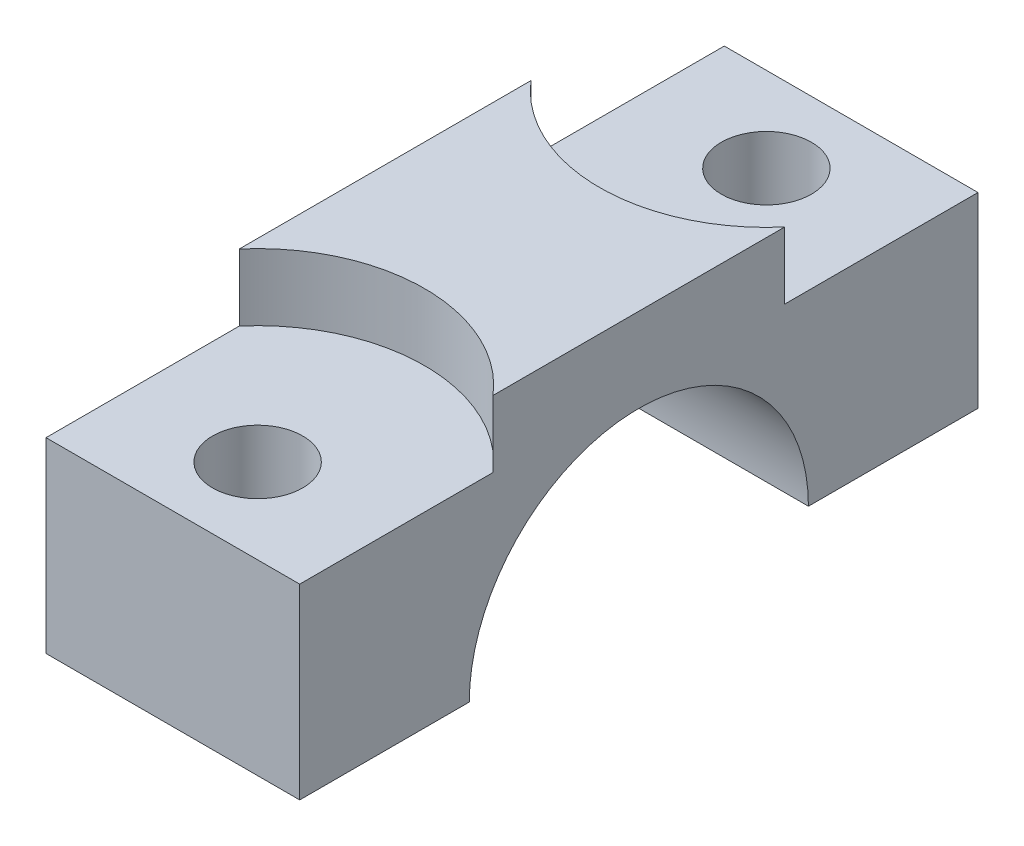
ISO-10303-21;
HEADER;
FILE_DESCRIPTION(('STEP AP214'),'2;1');
FILE_NAME('part.step','',(''),(''),'','','');
FILE_SCHEMA(('AUTOMOTIVE_DESIGN { 1 0 10303 214 1 1 1 1 }'));
ENDSEC;
DATA;
#1=APPLICATION_CONTEXT('core data for automotive mechanical design processes');
#2=APPLICATION_PROTOCOL_DEFINITION('international standard','automotive_design',2000,#1);
#3=PRODUCT_CONTEXT('',#1,'mechanical');
#4=PRODUCT('Part','Part','',(#3));
#5=PRODUCT_RELATED_PRODUCT_CATEGORY('part','',(#4));
#6=PRODUCT_DEFINITION_FORMATION('','',#4);
#7=PRODUCT_DEFINITION_CONTEXT('part definition',#1,'design');
#8=PRODUCT_DEFINITION('design','',#6,#7);
#9=PRODUCT_DEFINITION_SHAPE('','',#8);
#10=(LENGTH_UNIT() NAMED_UNIT(*) SI_UNIT(.MILLI.,.METRE.));
#11=(NAMED_UNIT(*) PLANE_ANGLE_UNIT() SI_UNIT($,.RADIAN.));
#12=(NAMED_UNIT(*) SI_UNIT($,.STERADIAN.) SOLID_ANGLE_UNIT());
#13=UNCERTAINTY_MEASURE_WITH_UNIT(LENGTH_MEASURE(1.E-05),#10,'distance_accuracy_value','');
#14=(GEOMETRIC_REPRESENTATION_CONTEXT(3) GLOBAL_UNCERTAINTY_ASSIGNED_CONTEXT((#13)) GLOBAL_UNIT_ASSIGNED_CONTEXT((#10,
#11,#12)) REPRESENTATION_CONTEXT('',''));
#15=CARTESIAN_POINT('',(0.,0.,0.));
#16=DIRECTION('',(0.,0.,1.));
#17=DIRECTION('',(1.,0.,0.));
#18=AXIS2_PLACEMENT_3D('',#15,#16,#17);
#19=CARTESIAN_POINT('',(9.5,19.,25.4));
#20=DIRECTION('',(0.,-1.,0.));
#21=DIRECTION('',(0.,0.,-1.));
#22=AXIS2_PLACEMENT_3D('',#19,#20,#21);
#23=PLANE('',#22);
#24=CARTESIAN_POINT('',(0.,19.,-19.05));
#25=DIRECTION('',(0.,1.,0.));
#26=DIRECTION('',(0.,0.,1.));
#27=AXIS2_PLACEMENT_3D('',#24,#25,#26);
#28=CIRCLE('',#27,12.5);
#29=CARTESIAN_POINT('',(-9.5,19.,-10.925961595364));
#30=VERTEX_POINT('',#29);
#31=CARTESIAN_POINT('',(9.5,19.,-10.925961595364));
#32=VERTEX_POINT('',#31);
#33=EDGE_CURVE('E55',#30,#32,#28,.T.);
#34=ORIENTED_EDGE('',*,*,#33,.F.);
#35=DIRECTION('',(0.,0.,1.));
#36=VECTOR('',#35,1.);
#37=CARTESIAN_POINT('',(-9.5,19.,25.4));
#38=LINE('',#37,#36);
#39=CARTESIAN_POINT('',(-9.5,19.,10.925961595364));
#40=VERTEX_POINT('',#39);
#41=EDGE_CURVE('E130',#30,#40,#38,.T.);
#42=ORIENTED_EDGE('',*,*,#41,.T.);
#43=CARTESIAN_POINT('',(0.,19.,19.05));
#44=DIRECTION('',(0.,1.,0.));
#45=DIRECTION('',(0.,0.,1.));
#46=AXIS2_PLACEMENT_3D('',#43,#44,#45);
#47=CIRCLE('',#46,12.5);
#48=CARTESIAN_POINT('',(9.5,19.,10.925961595364));
#49=VERTEX_POINT('',#48);
#50=EDGE_CURVE('E207',#49,#40,#47,.T.);
#51=ORIENTED_EDGE('',*,*,#50,.F.);
#52=DIRECTION('',(0.,0.,1.));
#53=VECTOR('',#52,1.);
#54=CARTESIAN_POINT('',(9.5,19.,25.4));
#55=LINE('',#54,#53);
#56=EDGE_CURVE('E132',#32,#49,#55,.T.);
#57=ORIENTED_EDGE('',*,*,#56,.F.);
#58=EDGE_LOOP('',(#34,#42,#51,#57));
#59=FACE_BOUND('',#58,.T.);
#60=ADVANCED_FACE('F39',(#59),#23,.F.);
#61=CARTESIAN_POINT('',(9.5,19.,-25.4));
#62=DIRECTION('',(0.,0.,1.));
#63=DIRECTION('',(1.,0.,0.));
#64=AXIS2_PLACEMENT_3D('',#61,#62,#63);
#65=PLANE('',#64);
#66=DIRECTION('',(0.,1.,0.));
#67=VECTOR('',#66,1.);
#68=CARTESIAN_POINT('',(-9.5,19.,-25.4));
#69=LINE('',#68,#67);
#70=CARTESIAN_POINT('',(-9.5,0.,-25.4));
#71=VERTEX_POINT('',#70);
#72=CARTESIAN_POINT('',(-9.5,14.,-25.4));
#73=VERTEX_POINT('',#72);
#74=EDGE_CURVE('E141',#71,#73,#69,.T.);
#75=ORIENTED_EDGE('',*,*,#74,.T.);
#76=DIRECTION('',(1.,0.,0.));
#77=VECTOR('',#76,1.);
#78=CARTESIAN_POINT('',(9.5,14.,-25.4));
#79=LINE('',#78,#77);
#80=CARTESIAN_POINT('',(9.5,14.,-25.4));
#81=VERTEX_POINT('',#80);
#82=EDGE_CURVE('E124',#73,#81,#79,.T.);
#83=ORIENTED_EDGE('',*,*,#82,.T.);
#84=DIRECTION('',(0.,1.,0.));
#85=VECTOR('',#84,1.);
#86=CARTESIAN_POINT('',(9.5,19.,-25.4));
#87=LINE('',#86,#85);
#88=CARTESIAN_POINT('',(9.5,0.,-25.4));
#89=VERTEX_POINT('',#88);
#90=EDGE_CURVE('E159',#89,#81,#87,.T.);
#91=ORIENTED_EDGE('',*,*,#90,.F.);
#92=DIRECTION('',(-1.,0.,0.));
#93=VECTOR('',#92,1.);
#94=CARTESIAN_POINT('',(9.5,0.,-25.4));
#95=LINE('',#94,#93);
#96=EDGE_CURVE('E160',#89,#71,#95,.T.);
#97=ORIENTED_EDGE('',*,*,#96,.T.);
#98=EDGE_LOOP('',(#75,#83,#91,#97));
#99=FACE_BOUND('',#98,.T.);
#100=ADVANCED_FACE('F41',(#99),#65,.F.);
#101=CARTESIAN_POINT('',(9.5,19.,25.4));
#102=DIRECTION('',(0.,0.,-1.));
#103=DIRECTION('',(-1.,0.,0.));
#104=AXIS2_PLACEMENT_3D('',#101,#102,#103);
#105=PLANE('',#104);
#106=DIRECTION('',(0.,-1.,0.));
#107=VECTOR('',#106,1.);
#108=CARTESIAN_POINT('',(9.5,19.,25.4));
#109=LINE('',#108,#107);
#110=CARTESIAN_POINT('',(9.5,14.,25.4));
#111=VERTEX_POINT('',#110);
#112=CARTESIAN_POINT('',(9.5,0.,25.4));
#113=VERTEX_POINT('',#112);
#114=EDGE_CURVE('E233',#111,#113,#109,.T.);
#115=ORIENTED_EDGE('',*,*,#114,.F.);
#116=DIRECTION('',(-1.,0.,0.));
#117=VECTOR('',#116,1.);
#118=CARTESIAN_POINT('',(9.5,14.,25.4));
#119=LINE('',#118,#117);
#120=CARTESIAN_POINT('',(-9.5,14.,25.4));
#121=VERTEX_POINT('',#120);
#122=EDGE_CURVE('E63',#111,#121,#119,.T.);
#123=ORIENTED_EDGE('',*,*,#122,.T.);
#124=DIRECTION('',(0.,-1.,0.));
#125=VECTOR('',#124,1.);
#126=CARTESIAN_POINT('',(-9.5,19.,25.4));
#127=LINE('',#126,#125);
#128=CARTESIAN_POINT('',(-9.5,0.,25.4));
#129=VERTEX_POINT('',#128);
#130=EDGE_CURVE('E140',#121,#129,#127,.T.);
#131=ORIENTED_EDGE('',*,*,#130,.T.);
#132=DIRECTION('',(-1.,0.,0.));
#133=VECTOR('',#132,1.);
#134=CARTESIAN_POINT('',(9.5,0.,25.4));
#135=LINE('',#134,#133);
#136=EDGE_CURVE('E173',#113,#129,#135,.T.);
#137=ORIENTED_EDGE('',*,*,#136,.F.);
#138=EDGE_LOOP('',(#115,#123,#131,#137));
#139=FACE_BOUND('',#138,.T.);
#140=ADVANCED_FACE('F264',(#139),#105,.F.);
#141=CARTESIAN_POINT('',(9.5,0.,25.4));
#142=DIRECTION('',(0.,1.,0.));
#143=DIRECTION('',(0.,0.,1.));
#144=AXIS2_PLACEMENT_3D('',#141,#142,#143);
#145=PLANE('',#144);
#146=CARTESIAN_POINT('',(0.,0.,19.05));
#147=DIRECTION('',(0.,1.,0.));
#148=DIRECTION('',(0.,0.,1.));
#149=AXIS2_PLACEMENT_3D('',#146,#147,#148);
#150=CIRCLE('',#149,3.375);
#151=CARTESIAN_POINT('',(0.,0.,22.425));
#152=VERTEX_POINT('',#151);
#153=EDGE_CURVE('E218',#152,#152,#150,.T.);
#154=ORIENTED_EDGE('',*,*,#153,.T.);
#155=EDGE_LOOP('',(#154));
#156=FACE_BOUND('',#155,.T.);
#157=DIRECTION('',(0.,0.,-1.));
#158=VECTOR('',#157,1.);
#159=CARTESIAN_POINT('',(-9.5,0.,25.4));
#160=LINE('',#159,#158);
#161=CARTESIAN_POINT('',(-9.5,0.,12.7));
#162=VERTEX_POINT('',#161);
#163=EDGE_CURVE('E145',#129,#162,#160,.T.);
#164=ORIENTED_EDGE('',*,*,#163,.T.);
#165=DIRECTION('',(-1.,0.,0.));
#166=VECTOR('',#165,1.);
#167=CARTESIAN_POINT('',(9.5,0.,12.7));
#168=LINE('',#167,#166);
#169=CARTESIAN_POINT('',(9.5,0.,12.7));
#170=VERTEX_POINT('',#169);
#171=EDGE_CURVE('E169',#170,#162,#168,.T.);
#172=ORIENTED_EDGE('',*,*,#171,.F.);
#173=DIRECTION('',(0.,0.,-1.));
#174=VECTOR('',#173,1.);
#175=CARTESIAN_POINT('',(9.5,0.,25.4));
#176=LINE('',#175,#174);
#177=EDGE_CURVE('E236',#113,#170,#176,.T.);
#178=ORIENTED_EDGE('',*,*,#177,.F.);
#179=ORIENTED_EDGE('',*,*,#136,.T.);
#180=EDGE_LOOP('',(#164,#172,#178,#179));
#181=FACE_BOUND('',#180,.T.);
#182=ADVANCED_FACE('F260',(#156,#181),#145,.F.);
#183=CARTESIAN_POINT('',(9.5,0.,0.));
#184=DIRECTION('',(-1.,0.,0.));
#185=DIRECTION('',(0.,0.,1.));
#186=AXIS2_PLACEMENT_3D('',#183,#184,#185);
#187=CYLINDRICAL_SURFACE('',#186,12.7);
#188=CARTESIAN_POINT('',(-9.5,0.,0.));
#189=DIRECTION('',(-1.,0.,0.));
#190=DIRECTION('',(0.,0.,1.));
#191=AXIS2_PLACEMENT_3D('',#188,#189,#190);
#192=CIRCLE('',#191,12.7);
#193=CARTESIAN_POINT('',(-9.5,0.,-12.7));
#194=VERTEX_POINT('',#193);
#195=EDGE_CURVE('E153',#162,#194,#192,.T.);
#196=ORIENTED_EDGE('',*,*,#195,.T.);
#197=DIRECTION('',(-1.,0.,0.));
#198=VECTOR('',#197,1.);
#199=CARTESIAN_POINT('',(9.5,0.,-12.7));
#200=LINE('',#199,#198);
#201=CARTESIAN_POINT('',(9.5,0.,-12.7));
#202=VERTEX_POINT('',#201);
#203=EDGE_CURVE('E164',#202,#194,#200,.T.);
#204=ORIENTED_EDGE('',*,*,#203,.F.);
#205=CARTESIAN_POINT('',(9.5,0.,0.));
#206=DIRECTION('',(-1.,0.,0.));
#207=DIRECTION('',(0.,0.,1.));
#208=AXIS2_PLACEMENT_3D('',#205,#206,#207);
#209=CIRCLE('',#208,12.7);
#210=EDGE_CURVE('E239',#170,#202,#209,.T.);
#211=ORIENTED_EDGE('',*,*,#210,.F.);
#212=ORIENTED_EDGE('',*,*,#171,.T.);
#213=EDGE_LOOP('',(#196,#204,#211,#212));
#214=FACE_BOUND('',#213,.T.);
#215=ADVANCED_FACE('F256',(#214),#187,.F.);
#216=CARTESIAN_POINT('',(9.5,0.,-12.7));
#217=DIRECTION('',(0.,1.,0.));
#218=DIRECTION('',(0.,0.,1.));
#219=AXIS2_PLACEMENT_3D('',#216,#217,#218);
#220=PLANE('',#219);
#221=CARTESIAN_POINT('',(0.,0.,-19.05));
#222=DIRECTION('',(0.,1.,0.));
#223=DIRECTION('',(0.,0.,1.));
#224=AXIS2_PLACEMENT_3D('',#221,#222,#223);
#225=CIRCLE('',#224,3.375);
#226=CARTESIAN_POINT('',(0.,0.,-15.675));
#227=VERTEX_POINT('',#226);
#228=EDGE_CURVE('E125',#227,#227,#225,.T.);
#229=ORIENTED_EDGE('',*,*,#228,.T.);
#230=EDGE_LOOP('',(#229));
#231=FACE_BOUND('',#230,.T.);
#232=DIRECTION('',(0.,0.,-1.));
#233=VECTOR('',#232,1.);
#234=CARTESIAN_POINT('',(-9.5,0.,-12.7));
#235=LINE('',#234,#233);
#236=EDGE_CURVE('E156',#194,#71,#235,.T.);
#237=ORIENTED_EDGE('',*,*,#236,.T.);
#238=ORIENTED_EDGE('',*,*,#96,.F.);
#239=DIRECTION('',(0.,0.,-1.));
#240=VECTOR('',#239,1.);
#241=CARTESIAN_POINT('',(9.5,0.,-12.7));
#242=LINE('',#241,#240);
#243=EDGE_CURVE('E165',#202,#89,#242,.T.);
#244=ORIENTED_EDGE('',*,*,#243,.F.);
#245=ORIENTED_EDGE('',*,*,#203,.T.);
#246=EDGE_LOOP('',(#237,#238,#244,#245));
#247=FACE_BOUND('',#246,.T.);
#248=ADVANCED_FACE('F248',(#231,#247),#220,.F.);
#249=CARTESIAN_POINT('',(9.5,0.,0.));
#250=DIRECTION('',(-1.,0.,0.));
#251=DIRECTION('',(0.,0.,1.));
#252=AXIS2_PLACEMENT_3D('',#249,#250,#251);
#253=PLANE('',#252);
#254=ORIENTED_EDGE('',*,*,#90,.T.);
#255=DIRECTION('',(0.,0.,1.));
#256=VECTOR('',#255,1.);
#257=CARTESIAN_POINT('',(9.5,14.,0.));
#258=LINE('',#257,#256);
#259=CARTESIAN_POINT('',(9.5,14.,-10.925961595364));
#260=VERTEX_POINT('',#259);
#261=EDGE_CURVE('E11',#81,#260,#258,.T.);
#262=ORIENTED_EDGE('',*,*,#261,.T.);
#263=DIRECTION('',(0.,1.,0.));
#264=VECTOR('',#263,1.);
#265=CARTESIAN_POINT('',(9.5,19.,-10.925961595364));
#266=LINE('',#265,#264);
#267=EDGE_CURVE('E48',#260,#32,#266,.T.);
#268=ORIENTED_EDGE('',*,*,#267,.T.);
#269=ORIENTED_EDGE('',*,*,#56,.T.);
#270=DIRECTION('',(0.,1.,0.));
#271=VECTOR('',#270,1.);
#272=CARTESIAN_POINT('',(9.5,19.,10.925961595364));
#273=LINE('',#272,#271);
#274=CARTESIAN_POINT('',(9.5,14.,10.925961595364));
#275=VERTEX_POINT('',#274);
#276=EDGE_CURVE('E180',#49,#275,#273,.F.);
#277=ORIENTED_EDGE('',*,*,#276,.T.);
#278=DIRECTION('',(0.,0.,1.));
#279=VECTOR('',#278,1.);
#280=CARTESIAN_POINT('',(9.5,14.,0.));
#281=LINE('',#280,#279);
#282=EDGE_CURVE('E177',#275,#111,#281,.T.);
#283=ORIENTED_EDGE('',*,*,#282,.T.);
#284=ORIENTED_EDGE('',*,*,#114,.T.);
#285=ORIENTED_EDGE('',*,*,#177,.T.);
#286=ORIENTED_EDGE('',*,*,#210,.T.);
#287=ORIENTED_EDGE('',*,*,#243,.T.);
#288=EDGE_LOOP('',(#254,#262,#268,#269,#277,#283,#284,#285,#286,#287));
#289=FACE_BOUND('',#288,.T.);
#290=ADVANCED_FACE('F186',(#289),#253,.F.);
#291=CARTESIAN_POINT('',(-9.5,0.,0.));
#292=DIRECTION('',(-1.,0.,0.));
#293=DIRECTION('',(0.,0.,1.));
#294=AXIS2_PLACEMENT_3D('',#291,#292,#293);
#295=PLANE('',#294);
#296=DIRECTION('',(0.,1.,0.));
#297=VECTOR('',#296,1.);
#298=CARTESIAN_POINT('',(-9.5,19.,-10.925961595364));
#299=LINE('',#298,#297);
#300=CARTESIAN_POINT('',(-9.5,14.,-10.925961595364));
#301=VERTEX_POINT('',#300);
#302=EDGE_CURVE('E116',#301,#30,#299,.T.);
#303=ORIENTED_EDGE('',*,*,#302,.F.);
#304=DIRECTION('',(0.,0.,1.));
#305=VECTOR('',#304,1.);
#306=CARTESIAN_POINT('',(-9.5,14.,0.));
#307=LINE('',#306,#305);
#308=EDGE_CURVE('E192',#73,#301,#307,.T.);
#309=ORIENTED_EDGE('',*,*,#308,.F.);
#310=ORIENTED_EDGE('',*,*,#74,.F.);
#311=ORIENTED_EDGE('',*,*,#236,.F.);
#312=ORIENTED_EDGE('',*,*,#195,.F.);
#313=ORIENTED_EDGE('',*,*,#163,.F.);
#314=ORIENTED_EDGE('',*,*,#130,.F.);
#315=DIRECTION('',(0.,0.,1.));
#316=VECTOR('',#315,1.);
#317=CARTESIAN_POINT('',(-9.5,14.,0.));
#318=LINE('',#317,#316);
#319=CARTESIAN_POINT('',(-9.5,14.,10.925961595364));
#320=VERTEX_POINT('',#319);
#321=EDGE_CURVE('E224',#320,#121,#318,.T.);
#322=ORIENTED_EDGE('',*,*,#321,.F.);
#323=DIRECTION('',(0.,1.,0.));
#324=VECTOR('',#323,1.);
#325=CARTESIAN_POINT('',(-9.5,19.,10.925961595364));
#326=LINE('',#325,#324);
#327=EDGE_CURVE('E138',#40,#320,#326,.F.);
#328=ORIENTED_EDGE('',*,*,#327,.F.);
#329=ORIENTED_EDGE('',*,*,#41,.F.);
#330=EDGE_LOOP('',(#303,#309,#310,#311,#312,#313,#314,#322,#328,#329));
#331=FACE_BOUND('',#330,.T.);
#332=ADVANCED_FACE('F136',(#331),#295,.T.);
#333=CARTESIAN_POINT('',(0.,19.,19.05));
#334=DIRECTION('',(0.,1.,0.));
#335=DIRECTION('',(0.,0.,1.));
#336=AXIS2_PLACEMENT_3D('',#333,#334,#335);
#337=CYLINDRICAL_SURFACE('',#336,3.375);
#338=ORIENTED_EDGE('',*,*,#153,.F.);
#339=EDGE_LOOP('',(#338));
#340=FACE_BOUND('',#339,.T.);
#341=CARTESIAN_POINT('',(0.,14.,19.05));
#342=DIRECTION('',(0.,1.,0.));
#343=DIRECTION('',(0.,0.,1.));
#344=AXIS2_PLACEMENT_3D('',#341,#342,#343);
#345=CIRCLE('',#344,3.375);
#346=CARTESIAN_POINT('',(0.,14.,22.425));
#347=VERTEX_POINT('',#346);
#348=EDGE_CURVE('E214',#347,#347,#345,.T.);
#349=ORIENTED_EDGE('',*,*,#348,.T.);
#350=EDGE_LOOP('',(#349));
#351=FACE_BOUND('',#350,.T.);
#352=ADVANCED_FACE('F279',(#340,#351),#337,.F.);
#353=CARTESIAN_POINT('',(3.375,14.,19.05));
#354=DIRECTION('',(0.,-1.,0.));
#355=DIRECTION('',(0.,0.,-1.));
#356=AXIS2_PLACEMENT_3D('',#353,#354,#355);
#357=PLANE('',#356);
#358=ORIENTED_EDGE('',*,*,#321,.T.);
#359=ORIENTED_EDGE('',*,*,#122,.F.);
#360=ORIENTED_EDGE('',*,*,#282,.F.);
#361=CARTESIAN_POINT('',(0.,14.,19.05));
#362=DIRECTION('',(0.,1.,0.));
#363=DIRECTION('',(0.,0.,1.));
#364=AXIS2_PLACEMENT_3D('',#361,#362,#363);
#365=CIRCLE('',#364,12.5);
#366=EDGE_CURVE('E210',#275,#320,#365,.T.);
#367=ORIENTED_EDGE('',*,*,#366,.T.);
#368=EDGE_LOOP('',(#358,#359,#360,#367));
#369=FACE_BOUND('',#368,.T.);
#370=ORIENTED_EDGE('',*,*,#348,.F.);
#371=EDGE_LOOP('',(#370));
#372=FACE_BOUND('',#371,.T.);
#373=ADVANCED_FACE('F265',(#369,#372),#357,.F.);
#374=CARTESIAN_POINT('',(0.,19.,19.05));
#375=DIRECTION('',(0.,1.,0.));
#376=DIRECTION('',(0.,0.,1.));
#377=AXIS2_PLACEMENT_3D('',#374,#375,#376);
#378=CYLINDRICAL_SURFACE('',#377,12.5);
#379=ORIENTED_EDGE('',*,*,#327,.T.);
#380=ORIENTED_EDGE('',*,*,#366,.F.);
#381=ORIENTED_EDGE('',*,*,#276,.F.);
#382=ORIENTED_EDGE('',*,*,#50,.T.);
#383=EDGE_LOOP('',(#379,#380,#381,#382));
#384=FACE_BOUND('',#383,.T.);
#385=ADVANCED_FACE('F269',(#384),#378,.F.);
#386=CARTESIAN_POINT('',(0.,19.,-19.05));
#387=DIRECTION('',(0.,1.,0.));
#388=DIRECTION('',(0.,0.,1.));
#389=AXIS2_PLACEMENT_3D('',#386,#387,#388);
#390=CYLINDRICAL_SURFACE('',#389,3.375);
#391=ORIENTED_EDGE('',*,*,#228,.F.);
#392=EDGE_LOOP('',(#391));
#393=FACE_BOUND('',#392,.T.);
#394=CARTESIAN_POINT('',(0.,14.,-19.05));
#395=DIRECTION('',(0.,1.,0.));
#396=DIRECTION('',(0.,0.,1.));
#397=AXIS2_PLACEMENT_3D('',#394,#395,#396);
#398=CIRCLE('',#397,3.375);
#399=CARTESIAN_POINT('',(0.,14.,-15.675));
#400=VERTEX_POINT('',#399);
#401=EDGE_CURVE('E194',#400,#400,#398,.T.);
#402=ORIENTED_EDGE('',*,*,#401,.T.);
#403=EDGE_LOOP('',(#402));
#404=FACE_BOUND('',#403,.T.);
#405=ADVANCED_FACE('F271',(#393,#404),#390,.F.);
#406=CARTESIAN_POINT('',(3.375,14.,-19.05));
#407=DIRECTION('',(0.,-1.,0.));
#408=DIRECTION('',(0.,0.,-1.));
#409=AXIS2_PLACEMENT_3D('',#406,#407,#408);
#410=PLANE('',#409);
#411=ORIENTED_EDGE('',*,*,#308,.T.);
#412=CARTESIAN_POINT('',(0.,14.,-19.05));
#413=DIRECTION('',(0.,1.,0.));
#414=DIRECTION('',(0.,0.,1.));
#415=AXIS2_PLACEMENT_3D('',#412,#413,#414);
#416=CIRCLE('',#415,12.5);
#417=EDGE_CURVE('E119',#301,#260,#416,.T.);
#418=ORIENTED_EDGE('',*,*,#417,.T.);
#419=ORIENTED_EDGE('',*,*,#261,.F.);
#420=ORIENTED_EDGE('',*,*,#82,.F.);
#421=EDGE_LOOP('',(#411,#418,#419,#420));
#422=FACE_BOUND('',#421,.T.);
#423=ORIENTED_EDGE('',*,*,#401,.F.);
#424=EDGE_LOOP('',(#423));
#425=FACE_BOUND('',#424,.T.);
#426=ADVANCED_FACE('F189',(#422,#425),#410,.F.);
#427=CARTESIAN_POINT('',(0.,19.,-19.05));
#428=DIRECTION('',(0.,1.,0.));
#429=DIRECTION('',(0.,0.,1.));
#430=AXIS2_PLACEMENT_3D('',#427,#428,#429);
#431=CYLINDRICAL_SURFACE('',#430,12.5);
#432=ORIENTED_EDGE('',*,*,#302,.T.);
#433=ORIENTED_EDGE('',*,*,#33,.T.);
#434=ORIENTED_EDGE('',*,*,#267,.F.);
#435=ORIENTED_EDGE('',*,*,#417,.F.);
#436=EDGE_LOOP('',(#432,#433,#434,#435));
#437=FACE_BOUND('',#436,.T.);
#438=ADVANCED_FACE('F117',(#437),#431,.F.);
#439=CLOSED_SHELL('',(#60,#100,#140,#182,#215,#248,#290,#332,#352,#373,#385,#405,#426,#438));
#440=MANIFOLD_SOLID_BREP('B2',#439);
#441=ADVANCED_BREP_SHAPE_REPRESENTATION('',(#18,#440),#14);
#442=SHAPE_DEFINITION_REPRESENTATION(#9,#441);
ENDSEC;
END-ISO-10303-21;
